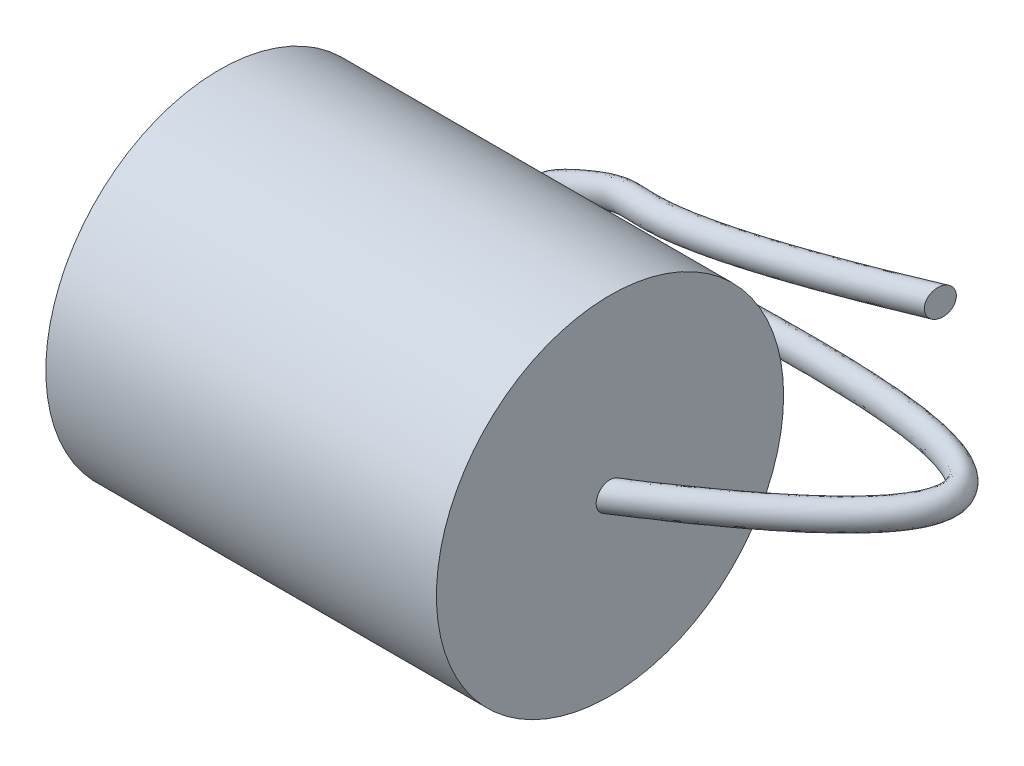
ISO-10303-21;
HEADER;
FILE_DESCRIPTION(('STEP AP214'),'2;1');
FILE_NAME('part.step','',(''),(''),'','','');
FILE_SCHEMA(('AUTOMOTIVE_DESIGN { 1 0 10303 214 1 1 1 1 }'));
ENDSEC;
DATA;
#1=APPLICATION_CONTEXT('core data for automotive mechanical design processes');
#2=APPLICATION_PROTOCOL_DEFINITION('international standard','automotive_design',2000,#1);
#3=PRODUCT_CONTEXT('',#1,'mechanical');
#4=PRODUCT('Part','Part','',(#3));
#5=PRODUCT_RELATED_PRODUCT_CATEGORY('part','',(#4));
#6=PRODUCT_DEFINITION_FORMATION('','',#4);
#7=PRODUCT_DEFINITION_CONTEXT('part definition',#1,'design');
#8=PRODUCT_DEFINITION('design','',#6,#7);
#9=PRODUCT_DEFINITION_SHAPE('','',#8);
#10=(LENGTH_UNIT() NAMED_UNIT(*) SI_UNIT(.MILLI.,.METRE.));
#11=(NAMED_UNIT(*) PLANE_ANGLE_UNIT() SI_UNIT($,.RADIAN.));
#12=(NAMED_UNIT(*) SI_UNIT($,.STERADIAN.) SOLID_ANGLE_UNIT());
#13=UNCERTAINTY_MEASURE_WITH_UNIT(LENGTH_MEASURE(1.E-05),#10,'distance_accuracy_value','');
#14=(GEOMETRIC_REPRESENTATION_CONTEXT(3) GLOBAL_UNCERTAINTY_ASSIGNED_CONTEXT((#13)) GLOBAL_UNIT_ASSIGNED_CONTEXT((#10,
#11,#12)) REPRESENTATION_CONTEXT('',''));
#15=CARTESIAN_POINT('',(0.,0.,0.));
#16=DIRECTION('',(0.,0.,1.));
#17=DIRECTION('',(1.,0.,0.));
#18=AXIS2_PLACEMENT_3D('',#15,#16,#17);
#19=CARTESIAN_POINT('',(450.,0.,0.));
#20=DIRECTION('',(1.,0.,0.));
#21=DIRECTION('',(0.,0.,-1.));
#22=AXIS2_PLACEMENT_3D('',#19,#20,#21);
#23=PLANE('',#22);
#24=CARTESIAN_POINT('',(450.,0.,0.));
#25=DIRECTION('',(1.,0.,0.));
#26=DIRECTION('',(0.,0.,-1.));
#27=AXIS2_PLACEMENT_3D('',#24,#25,#26);
#28=CIRCLE('',#27,15.9350485905769);
#29=CARTESIAN_POINT('',(450.,0.,-15.9350485905769));
#30=VERTEX_POINT('',#29);
#31=EDGE_CURVE('E50',#30,#30,#28,.T.);
#32=ORIENTED_EDGE('',*,*,#31,.F.);
#33=EDGE_LOOP('',(#32));
#34=FACE_BOUND('',#33,.T.);
#35=ADVANCED_FACE('F43',(#34),#23,.F.);
#36=CARTESIAN_POINT('',(447.290069253957,0.,-383.286785904496));
#37=DIRECTION('',(0.98502787894093,0.,0.172395120897123));
#38=DIRECTION('',(0.172395120897123,0.,-0.985027878940929));
#39=AXIS2_PLACEMENT_3D('',#36,#37,#38);
#40=PLANE('',#39);
#41=CARTESIAN_POINT('',(447.290069253957,0.,-383.286785904496));
#42=DIRECTION('',(0.98502787894093,0.,0.172395120897123));
#43=DIRECTION('',(0.172395120897123,0.,-0.985027878940929));
#44=AXIS2_PLACEMENT_3D('',#41,#42,#43);
#45=CIRCLE('',#44,15.9350485905769);
#46=CARTESIAN_POINT('',(450.037193882232,0.,-398.983253018492));
#47=VERTEX_POINT('',#46);
#48=EDGE_CURVE('E12',#47,#47,#45,.T.);
#49=ORIENTED_EDGE('',*,*,#48,.T.);
#50=EDGE_LOOP('',(#49));
#51=FACE_BOUND('',#50,.T.);
#52=ADVANCED_FACE('F57',(#51),#40,.T.);
#53=CARTESIAN_POINT('',(450.,0.,-15.9350485905769));
#54=CARTESIAN_POINT('',(487.283479928861,0.,-40.1159519894092));
#55=CARTESIAN_POINT('',(518.405820007918,0.,-62.0370961338193));
#56=CARTESIAN_POINT('',(569.416705538855,0.,-101.711499646057));
#57=CARTESIAN_POINT('',(589.311439955493,0.,-119.475308233721));
#58=CARTESIAN_POINT('',(611.39598139131,0.,-143.122673492521));
#59=CARTESIAN_POINT('',(617.461790071146,0.,-150.503703261148));
#60=CARTESIAN_POINT('',(627.081378567519,0.,-164.208016330983));
#61=CARTESIAN_POINT('',(630.631559728341,0.,-170.533813201194));
#62=CARTESIAN_POINT('',(635.320636420215,0.,-181.952414586559));
#63=CARTESIAN_POINT('',(636.446652271699,0.,-187.039181245159));
#64=CARTESIAN_POINT('',(636.637928823664,0.,-195.674883478979));
#65=CARTESIAN_POINT('',(635.710068352326,0.,-199.188418823437));
#66=CARTESIAN_POINT('',(632.687342817224,0.,-204.827936442351));
#67=CARTESIAN_POINT('',(630.644312282098,0.,-206.989363247134));
#68=CARTESIAN_POINT('',(625.780783864075,0.,-211.03226240499));
#69=CARTESIAN_POINT('',(622.916416421137,0.,-212.945461388225));
#70=CARTESIAN_POINT('',(615.916351511869,0.,-216.884123605242));
#71=CARTESIAN_POINT('',(611.770405099374,0.,-218.881893832985));
#72=CARTESIAN_POINT('',(602.065481974739,0.,-222.766773985541));
#73=CARTESIAN_POINT('',(596.514115226064,0.,-224.647174120432));
#74=CARTESIAN_POINT('',(577.919034649782,0.,-229.888470590968));
#75=CARTESIAN_POINT('',(562.94206395766,0.,-232.826200248209));
#76=CARTESIAN_POINT('',(529.194872719515,0.,-237.344073505341));
#77=CARTESIAN_POINT('',(510.430738213572,0.,-238.944055188897));
#78=CARTESIAN_POINT('',(450.486536042876,0.,-242.092466981928));
#79=CARTESIAN_POINT('',(405.667295489393,0.,-241.986459045099));
#80=CARTESIAN_POINT('',(316.497100986066,0.,-240.300330478789));
#81=CARTESIAN_POINT('',(272.145073032516,0.,-238.729418672953));
#82=CARTESIAN_POINT('',(213.28803847988,0.,-237.798982777849));
#83=CARTESIAN_POINT('',(194.946356355671,0.,-237.726689811192));
#84=CARTESIAN_POINT('',(161.945643882749,0.,-238.560494257816));
#85=CARTESIAN_POINT('',(147.300457735724,0.,-239.443610170207));
#86=CARTESIAN_POINT('',(128.743163388277,0.,-242.128635480911));
#87=CARTESIAN_POINT('',(123.122586879475,0.,-243.249610286713));
#88=CARTESIAN_POINT('',(115.55086220012,0.,-245.513552705508));
#89=CARTESIAN_POINT('',(113.169143591937,0.,-246.36694636955));
#90=CARTESIAN_POINT('',(108.687246242811,0.,-248.366307648322));
#91=CARTESIAN_POINT('',(106.58516168639,0.,-249.510364207201));
#92=CARTESIAN_POINT('',(102.682662562865,0.,-252.270436870069));
#93=CARTESIAN_POINT('',(100.874458771896,0.,-253.887082120539));
#94=CARTESIAN_POINT('',(97.7284373385258,0.,-257.901451778305));
#95=CARTESIAN_POINT('',(96.3821576593703,0.,-260.326637157124));
#96=CARTESIAN_POINT('',(95.1873582950007,0.,-264.657496508215));
#97=CARTESIAN_POINT('',(94.9328288478735,0.,-266.211428082342));
#98=CARTESIAN_POINT('',(94.7992228724063,0.,-269.434857001848));
#99=CARTESIAN_POINT('',(94.9226846071824,0.,-271.101779435734));
#100=CARTESIAN_POINT('',(95.5481657509826,0.,-274.370430953765));
#101=CARTESIAN_POINT('',(96.0485968048313,0.,-275.96802025896));
#102=CARTESIAN_POINT('',(97.3138355884439,0.,-278.955953766217));
#103=CARTESIAN_POINT('',(98.0750655570512,0.,-280.346100446228));
#104=CARTESIAN_POINT('',(100.464253247315,0.,-284.043305617499));
#105=CARTESIAN_POINT('',(102.098197081397,0.,-285.953505685394));
#106=CARTESIAN_POINT('',(105.290658715794,0.,-289.407336549074));
#107=CARTESIAN_POINT('',(106.873165852383,0.,-290.946487403058));
#108=CARTESIAN_POINT('',(111.683013595245,0.,-295.383906776255));
#109=CARTESIAN_POINT('',(115.001717199517,0.,-298.111211161091));
#110=CARTESIAN_POINT('',(121.960437207708,0.,-303.373313108974));
#111=CARTESIAN_POINT('',(125.583550719089,0.,-305.880360072179));
#112=CARTESIAN_POINT('',(132.828644665928,0.,-310.451659336116));
#113=CARTESIAN_POINT('',(136.439413194835,0.,-312.513954777053));
#114=CARTESIAN_POINT('',(143.283964795914,0.,-315.85940289586));
#115=CARTESIAN_POINT('',(146.544405257232,0.,-317.151843616704));
#116=CARTESIAN_POINT('',(152.93439953659,0.,-319.066434200642));
#117=CARTESIAN_POINT('',(156.064000222027,0.,-319.683608204799));
#118=CARTESIAN_POINT('',(162.151177224142,0.,-320.37230655808));
#119=CARTESIAN_POINT('',(165.099127564158,0.,-320.44566132333));
#120=CARTESIAN_POINT('',(170.750506386605,0.,-320.337411761649));
#121=CARTESIAN_POINT('',(173.4522066844,0.,-320.163684004382));
#122=CARTESIAN_POINT('',(181.392950865369,0.,-319.670537077123));
#123=CARTESIAN_POINT('',(186.478715517806,0.,-319.411509515092));
#124=CARTESIAN_POINT('',(198.35036680869,0.,-319.66500560622));
#125=CARTESIAN_POINT('',(205.154785076576,0.,-320.128114685212));
#126=CARTESIAN_POINT('',(222.374376223485,0.,-322.358936763319));
#127=CARTESIAN_POINT('',(232.783783798729,0.,-324.137724010347));
#128=CARTESIAN_POINT('',(258.72849824763,0.,-330.003874443711));
#129=CARTESIAN_POINT('',(274.257797072658,0.,-334.096811234494));
#130=CARTESIAN_POINT('',(330.586988386846,0.,-351.436493906954));
#131=CARTESIAN_POINT('',(381.119046144559,0.,-369.75328644697));
#132=CARTESIAN_POINT('',(450.037193882232,0.,-398.983253018492));
#133=CARTESIAN_POINT('',(450.,31.8700971811538,-15.9350485905769));
#134=CARTESIAN_POINT('',(487.283479928861,31.8700971811538,-40.1159519894092));
#135=CARTESIAN_POINT('',(518.405820007918,31.8700971811538,-62.0370961338193));
#136=CARTESIAN_POINT('',(569.416705538855,31.8700971811538,-101.711499646057));
#137=CARTESIAN_POINT('',(589.311439955493,31.8700971811538,-119.475308233721));
#138=CARTESIAN_POINT('',(611.39598139131,31.8700971811538,-143.122673492521));
#139=CARTESIAN_POINT('',(617.461790071146,31.8700971811538,-150.503703261148));
#140=CARTESIAN_POINT('',(627.081378567519,31.8700971811538,-164.208016330983));
#141=CARTESIAN_POINT('',(630.631559728341,31.8700971811538,-170.533813201194));
#142=CARTESIAN_POINT('',(635.320636420215,31.8700971811538,-181.952414586559));
#143=CARTESIAN_POINT('',(636.446652271699,31.8700971811538,-187.039181245159));
#144=CARTESIAN_POINT('',(636.637928823664,31.8700971811538,-195.674883478979));
#145=CARTESIAN_POINT('',(635.710068352326,31.8700971811538,-199.188418823438));
#146=CARTESIAN_POINT('',(632.687342817224,31.8700971811538,-204.827936442351));
#147=CARTESIAN_POINT('',(630.644312282098,31.8700971811538,-206.989363247134));
#148=CARTESIAN_POINT('',(625.780783864075,31.8700971811538,-211.03226240499));
#149=CARTESIAN_POINT('',(622.916416421137,31.8700971811538,-212.945461388225));
#150=CARTESIAN_POINT('',(615.916351511869,31.8700971811538,-216.884123605242));
#151=CARTESIAN_POINT('',(611.770405099374,31.8700971811538,-218.881893832985));
#152=CARTESIAN_POINT('',(602.065481974739,31.8700971811538,-222.766773985541));
#153=CARTESIAN_POINT('',(596.514115226064,31.8700971811538,-224.647174120432));
#154=CARTESIAN_POINT('',(577.919034649782,31.8700971811538,-229.888470590968));
#155=CARTESIAN_POINT('',(562.94206395766,31.8700971811538,-232.826200248209));
#156=CARTESIAN_POINT('',(529.194872719515,31.8700971811538,-237.344073505341));
#157=CARTESIAN_POINT('',(510.430738213572,31.8700971811538,-238.944055188897));
#158=CARTESIAN_POINT('',(450.486536042876,31.8700971811538,-242.092466981928));
#159=CARTESIAN_POINT('',(405.667295489393,31.8700971811538,-241.986459045099));
#160=CARTESIAN_POINT('',(316.497100986066,31.8700971811538,-240.300330478789));
#161=CARTESIAN_POINT('',(272.145073032516,31.8700971811538,-238.729418672953));
#162=CARTESIAN_POINT('',(213.28803847988,31.8700971811538,-237.798982777849));
#163=CARTESIAN_POINT('',(194.946356355671,31.8700971811538,-237.726689811192));
#164=CARTESIAN_POINT('',(161.945643882749,31.8700971811538,-238.560494257816));
#165=CARTESIAN_POINT('',(147.300457735724,31.8700971811538,-239.443610170207));
#166=CARTESIAN_POINT('',(128.743163388277,31.8700971811538,-242.128635480911));
#167=CARTESIAN_POINT('',(123.122586879475,31.8700971811538,-243.249610286713));
#168=CARTESIAN_POINT('',(115.55086220012,31.8700971811538,-245.513552705508));
#169=CARTESIAN_POINT('',(113.169143591937,31.8700971811538,-246.36694636955));
#170=CARTESIAN_POINT('',(108.687246242811,31.8700971811538,-248.366307648322));
#171=CARTESIAN_POINT('',(106.58516168639,31.8700971811538,-249.510364207201));
#172=CARTESIAN_POINT('',(102.682662562865,31.8700971811538,-252.27043687007));
#173=CARTESIAN_POINT('',(100.874458771896,31.8700971811538,-253.887082120539));
#174=CARTESIAN_POINT('',(97.7284373385258,31.8700971811538,-257.901451778305));
#175=CARTESIAN_POINT('',(96.3821576593703,31.8700971811538,-260.326637157124));
#176=CARTESIAN_POINT('',(95.1873582950007,31.8700971811538,-264.657496508215));
#177=CARTESIAN_POINT('',(94.9328288478735,31.8700971811538,-266.211428082342));
#178=CARTESIAN_POINT('',(94.7992228724063,31.8700971811538,-269.434857001848));
#179=CARTESIAN_POINT('',(94.9226846071825,31.8700971811538,-271.101779435734));
#180=CARTESIAN_POINT('',(95.5481657509826,31.8700971811538,-274.370430953765));
#181=CARTESIAN_POINT('',(96.0485968048313,31.8700971811538,-275.96802025896));
#182=CARTESIAN_POINT('',(97.3138355884439,31.8700971811538,-278.955953766217));
#183=CARTESIAN_POINT('',(98.0750655570512,31.8700971811538,-280.346100446228));
#184=CARTESIAN_POINT('',(100.464253247315,31.8700971811538,-284.043305617499));
#185=CARTESIAN_POINT('',(102.098197081397,31.8700971811538,-285.953505685394));
#186=CARTESIAN_POINT('',(105.290658715794,31.8700971811538,-289.407336549074));
#187=CARTESIAN_POINT('',(106.873165852384,31.8700971811538,-290.946487403058));
#188=CARTESIAN_POINT('',(111.683013595245,31.8700971811538,-295.383906776255));
#189=CARTESIAN_POINT('',(115.001717199517,31.8700971811538,-298.111211161091));
#190=CARTESIAN_POINT('',(121.960437207708,31.8700971811538,-303.373313108974));
#191=CARTESIAN_POINT('',(125.583550719089,31.8700971811538,-305.880360072179));
#192=CARTESIAN_POINT('',(132.828644665928,31.8700971811538,-310.451659336116));
#193=CARTESIAN_POINT('',(136.439413194835,31.8700971811538,-312.513954777053));
#194=CARTESIAN_POINT('',(143.283964795914,31.8700971811538,-315.85940289586));
#195=CARTESIAN_POINT('',(146.544405257232,31.8700971811538,-317.151843616704));
#196=CARTESIAN_POINT('',(152.93439953659,31.8700971811538,-319.066434200642));
#197=CARTESIAN_POINT('',(156.064000222027,31.8700971811538,-319.683608204799));
#198=CARTESIAN_POINT('',(162.151177224142,31.8700971811538,-320.37230655808));
#199=CARTESIAN_POINT('',(165.099127564158,31.8700971811538,-320.44566132333));
#200=CARTESIAN_POINT('',(170.750506386605,31.8700971811538,-320.337411761649));
#201=CARTESIAN_POINT('',(173.4522066844,31.8700971811538,-320.163684004382));
#202=CARTESIAN_POINT('',(181.392950865369,31.8700971811538,-319.670537077123));
#203=CARTESIAN_POINT('',(186.478715517806,31.8700971811538,-319.411509515092));
#204=CARTESIAN_POINT('',(198.35036680869,31.8700971811538,-319.66500560622));
#205=CARTESIAN_POINT('',(205.154785076576,31.8700971811538,-320.128114685212));
#206=CARTESIAN_POINT('',(222.374376223485,31.8700971811538,-322.358936763319));
#207=CARTESIAN_POINT('',(232.783783798729,31.8700971811538,-324.137724010347));
#208=CARTESIAN_POINT('',(258.72849824763,31.8700971811538,-330.003874443711));
#209=CARTESIAN_POINT('',(274.257797072658,31.8700971811538,-334.096811234494));
#210=CARTESIAN_POINT('',(330.586988386846,31.8700971811538,-351.436493906954));
#211=CARTESIAN_POINT('',(381.119046144559,31.8700971811538,-369.75328644697));
#212=CARTESIAN_POINT('',(450.037193882232,31.8700971811538,-398.983253018492));
#213=CARTESIAN_POINT('',(450.,31.8700971811538,15.9350485905769));
#214=CARTESIAN_POINT('',(487.948222753525,31.8700971811538,-8.24585480856572));
#215=CARTESIAN_POINT('',(519.875767458581,31.8700971811538,-30.1820120849856));
#216=CARTESIAN_POINT('',(573.074107983889,31.8700971811538,-70.0329496071743));
#217=CARTESIAN_POINT('',(594.338714872811,31.8700971811538,-87.9371806318083));
#218=CARTESIAN_POINT('',(619.430097091602,31.8700971811538,-112.264740118511));
#219=CARTESIAN_POINT('',(626.662414916646,31.8700971811538,-119.954162826123));
#220=CARTESIAN_POINT('',(639.093853217101,31.8700971811538,-134.6508451012));
#221=CARTESIAN_POINT('',(644.296572345665,31.8700971811538,-141.655591100862));
#222=CARTESIAN_POINT('',(652.87720657848,31.8700971811538,-155.260634470481));
#223=CARTESIAN_POINT('',(656.26800135455,31.8700971811538,-161.866969695235));
#224=CARTESIAN_POINT('',(661.18339295356,31.8700971811538,-175.082498857955));
#225=CARTESIAN_POINT('',(662.701110943773,31.8700971811538,-181.727093026576));
#226=CARTESIAN_POINT('',(663.285734957927,31.8700971811538,-194.971330681788));
#227=CARTESIAN_POINT('',(662.30080645289,31.8700971811538,-201.535529636209));
#228=CARTESIAN_POINT('',(657.799736783493,31.8700971811538,-213.613846861236));
#229=CARTESIAN_POINT('',(654.327465176799,31.8700971811538,-219.096238501295));
#230=CARTESIAN_POINT('',(645.654708534103,31.8700971811538,-228.721191008817));
#231=CARTESIAN_POINT('',(640.46447243825,31.8700971811538,-232.891444885101));
#232=CARTESIAN_POINT('',(628.806623649466,31.8700971811538,-240.217515032561));
#233=CARTESIAN_POINT('',(622.331400983792,31.8700971811538,-243.38004109818));
#234=CARTESIAN_POINT('',(601.274807794766,31.8700971811538,-251.733579292899));
#235=CARTESIAN_POINT('',(585.054788601338,31.8700971811538,-255.813814172833));
#236=CARTESIAN_POINT('',(549.356011041701,31.8700971811538,-262.06110177923));
#237=CARTESIAN_POINT('',(529.871166649746,31.8700971811538,-264.208316416651));
#238=CARTESIAN_POINT('',(468.200087222783,31.8700971811538,-268.624964674355));
#239=CARTESIAN_POINT('',(422.784680161595,31.8700971811538,-268.872307418009));
#240=CARTESIAN_POINT('',(332.954732307611,31.8700971811538,-267.595019924955));
#241=CARTESIAN_POINT('',(288.541265508462,31.8700971811538,-266.061180879245));
#242=CARTESIAN_POINT('',(230.19047703182,31.8700971811538,-264.818419856042));
#243=CARTESIAN_POINT('',(212.119621326518,31.8700971811538,-264.580302072708));
#244=CARTESIAN_POINT('',(180.0818235882,31.8700971811538,-264.773401516579));
#245=CARTESIAN_POINT('',(166.101037345564,31.8700971811538,-265.22760024029));
#246=CARTESIAN_POINT('',(149.414116501308,31.8700971811538,-266.399152627179));
#247=CARTESIAN_POINT('',(144.569078509497,31.8700971811538,-266.872138009023));
#248=CARTESIAN_POINT('',(138.597919699056,31.8700971811538,-267.538638770733));
#249=CARTESIAN_POINT('',(136.824600186987,31.8700971811538,-267.751976649658));
#250=CARTESIAN_POINT('',(133.753576118954,31.8700971811538,-268.078721332532));
#251=CARTESIAN_POINT('',(132.457777377173,31.8700971811538,-268.194039192903));
#252=CARTESIAN_POINT('',(130.360306796833,31.8700971811538,-268.158166821632));
#253=CARTESIAN_POINT('',(129.566424180645,31.8700971811538,-268.006347443261));
#254=CARTESIAN_POINT('',(128.342711761511,31.8700971811538,-267.139889561102));
#255=CARTESIAN_POINT('',(127.921343993166,31.8700971811538,-266.397790084688));
#256=CARTESIAN_POINT('',(127.119482960201,31.8700971811538,-264.764861043457));
#257=CARTESIAN_POINT('',(126.817594069264,31.8700971811538,-264.139123148391));
#258=CARTESIAN_POINT('',(126.06146388629,31.8700971811538,-262.83144981131));
#259=CARTESIAN_POINT('',(125.604684329258,31.8700971811538,-262.152089280495));
#260=CARTESIAN_POINT('',(124.540498317294,31.8700971811538,-260.919530864997));
#261=CARTESIAN_POINT('',(123.934680215645,31.8700971811538,-260.370472758957));
#262=CARTESIAN_POINT('',(122.691428371354,31.8700971811538,-259.542172018747));
#263=CARTESIAN_POINT('',(122.057572388726,31.8700971811538,-259.26312690647));
#264=CARTESIAN_POINT('',(120.38188757354,31.8700971811538,-258.879358132878));
#265=CARTESIAN_POINT('',(119.643416117769,31.8700971811538,-259.255044011017));
#266=CARTESIAN_POINT('',(118.960389254846,31.8700971811538,-260.532069714843));
#267=CARTESIAN_POINT('',(118.991844518616,31.8700971811538,-261.437889486222));
#268=CARTESIAN_POINT('',(119.894936637345,31.8700971811538,-264.465725520604));
#269=CARTESIAN_POINT('',(121.546263174031,31.8700971811538,-266.889049458067));
#270=CARTESIAN_POINT('',(125.74810462628,31.8700971811538,-271.698275003545));
#271=CARTESIAN_POINT('',(128.315522445167,31.8700971811538,-274.111927216628));
#272=CARTESIAN_POINT('',(133.569686407712,31.8700971811538,-278.574585242656));
#273=CARTESIAN_POINT('',(136.267644466065,31.8700971811538,-280.625547921381));
#274=CARTESIAN_POINT('',(140.94651755747,31.8700971811538,-284.05702046465));
#275=CARTESIAN_POINT('',(142.919196259871,31.8700971811538,-285.454166501472));
#276=CARTESIAN_POINT('',(146.392841364302,31.8700971811538,-287.839956791057));
#277=CARTESIAN_POINT('',(147.893760894594,31.8700971811538,-288.833576899081));
#278=CARTESIAN_POINT('',(150.809694998262,31.8700971811538,-290.541986024255));
#279=CARTESIAN_POINT('',(152.234335542475,31.8700971811538,-291.254944619433));
#280=CARTESIAN_POINT('',(155.414878778867,31.8700971811538,-292.365652049024));
#281=CARTESIAN_POINT('',(157.172509648874,31.8700971811538,-292.755524308036));
#282=CARTESIAN_POINT('',(163.256873830806,31.8700971811538,-293.42331930047));
#283=CARTESIAN_POINT('',(168.38400121255,31.8700971811538,-293.167064969385));
#284=CARTESIAN_POINT('',(181.421130517063,31.8700971811538,-292.654072377173));
#285=CARTESIAN_POINT('',(189.312600803753,31.8700971811538,-292.446748684585));
#286=CARTESIAN_POINT('',(208.725140208063,31.8700971811538,-293.533059805837));
#287=CARTESIAN_POINT('',(220.251974627948,31.8700971811538,-294.815620366396));
#288=CARTESIAN_POINT('',(248.177454531455,31.8700971811538,-299.912223115065));
#289=CARTESIAN_POINT('',(264.582108063487,31.8700971811538,-303.720691699564));
#290=CARTESIAN_POINT('',(323.187374742461,31.8700971811538,-320.397054192261));
#291=CARTESIAN_POINT('',(374.78842356563,31.8700971811538,-338.506730491628));
#292=CARTESIAN_POINT('',(444.542944625684,31.8700971811538,-367.590318790499));
#293=CARTESIAN_POINT('',(450.,0.,15.9350485905769));
#294=CARTESIAN_POINT('',(487.948222753525,0.,-8.24585480856572));
#295=CARTESIAN_POINT('',(519.875767458581,0.,-30.1820120849856));
#296=CARTESIAN_POINT('',(573.074107983889,0.,-70.0329496071743));
#297=CARTESIAN_POINT('',(594.338714872811,0.,-87.9371806317305));
#298=CARTESIAN_POINT('',(619.430097091602,0.,-112.26474011855));
#299=CARTESIAN_POINT('',(626.662414916646,0.,-119.95416282606));
#300=CARTESIAN_POINT('',(639.093853217101,0.,-134.650845101262));
#301=CARTESIAN_POINT('',(644.296572345664,0.,-141.655591100911));
#302=CARTESIAN_POINT('',(652.877206578479,0.,-155.260634470431));
#303=CARTESIAN_POINT('',(656.26800135455,0.,-161.866969695235));
#304=CARTESIAN_POINT('',(661.18339295356,0.,-175.082498857955));
#305=CARTESIAN_POINT('',(662.701110943773,0.,-181.727093026576));
#306=CARTESIAN_POINT('',(663.285734957927,0.,-194.971330681788));
#307=CARTESIAN_POINT('',(662.30080645289,0.,-201.535529636209));
#308=CARTESIAN_POINT('',(657.799736783493,0.,-213.613846861236));
#309=CARTESIAN_POINT('',(654.327465176799,0.,-219.096238501295));
#310=CARTESIAN_POINT('',(645.654708534103,0.,-228.721191008817));
#311=CARTESIAN_POINT('',(640.46447243825,0.,-232.891444885101));
#312=CARTESIAN_POINT('',(628.806623649466,0.,-240.217515032561));
#313=CARTESIAN_POINT('',(622.331400983792,0.,-243.38004109818));
#314=CARTESIAN_POINT('',(601.274807794766,0.,-251.733579292899));
#315=CARTESIAN_POINT('',(585.054788601338,0.,-255.813814172833));
#316=CARTESIAN_POINT('',(549.356011041701,0.,-262.06110177923));
#317=CARTESIAN_POINT('',(529.871166649746,0.,-264.208316416651));
#318=CARTESIAN_POINT('',(468.200087222783,0.,-268.624964674355));
#319=CARTESIAN_POINT('',(422.784680161595,0.,-268.872307418009));
#320=CARTESIAN_POINT('',(332.954732307611,0.,-267.595019924955));
#321=CARTESIAN_POINT('',(288.541265508462,0.,-266.061180879245));
#322=CARTESIAN_POINT('',(230.19047703182,0.,-264.818419856042));
#323=CARTESIAN_POINT('',(212.119621326518,0.,-264.580302072708));
#324=CARTESIAN_POINT('',(180.0818235882,0.,-264.773401516579));
#325=CARTESIAN_POINT('',(166.101037345564,0.,-265.22760024029));
#326=CARTESIAN_POINT('',(149.414116501309,0.,-266.399152627179));
#327=CARTESIAN_POINT('',(144.569078509433,0.,-266.872138009022));
#328=CARTESIAN_POINT('',(138.597919699088,0.,-267.538638770733));
#329=CARTESIAN_POINT('',(136.824600187015,0.,-267.751976649658));
#330=CARTESIAN_POINT('',(133.753576118926,0.,-268.078721332532));
#331=CARTESIAN_POINT('',(132.457777377173,0.,-268.194039192903));
#332=CARTESIAN_POINT('',(130.360306796834,0.,-268.158166821632));
#333=CARTESIAN_POINT('',(129.566424180636,0.,-268.006347443261));
#334=CARTESIAN_POINT('',(128.342711761521,0.,-267.139889561102));
#335=CARTESIAN_POINT('',(127.921343993174,0.,-266.397790084688));
#336=CARTESIAN_POINT('',(127.119482960197,0.,-264.764861043457));
#337=CARTESIAN_POINT('',(126.817594069264,0.,-264.139123148391));
#338=CARTESIAN_POINT('',(126.06146388629,0.,-262.83144981131));
#339=CARTESIAN_POINT('',(125.604684329255,0.,-262.152089280495));
#340=CARTESIAN_POINT('',(124.540498317297,0.,-260.919530864997));
#341=CARTESIAN_POINT('',(123.934680215637,0.,-260.370472758957));
#342=CARTESIAN_POINT('',(122.691428371361,0.,-259.542172018747));
#343=CARTESIAN_POINT('',(122.057572388726,0.,-259.26312690647));
#344=CARTESIAN_POINT('',(120.38188757354,0.,-258.879358132878));
#345=CARTESIAN_POINT('',(119.643416117769,0.,-259.255044011017));
#346=CARTESIAN_POINT('',(118.960389254846,0.,-260.532069714843));
#347=CARTESIAN_POINT('',(118.991844518616,0.,-261.437889486222));
#348=CARTESIAN_POINT('',(119.894936637344,0.,-264.465725520604));
#349=CARTESIAN_POINT('',(121.546263174031,0.,-266.889049458119));
#350=CARTESIAN_POINT('',(125.74810462628,0.,-271.698275003493));
#351=CARTESIAN_POINT('',(128.315522445167,0.,-274.111927216628));
#352=CARTESIAN_POINT('',(133.569686407712,0.,-278.574585242656));
#353=CARTESIAN_POINT('',(136.267644466065,0.,-280.625547921381));
#354=CARTESIAN_POINT('',(140.94651755747,0.,-284.05702046465));
#355=CARTESIAN_POINT('',(142.919196259871,0.,-285.454166501472));
#356=CARTESIAN_POINT('',(146.392841364302,0.,-287.839956791057));
#357=CARTESIAN_POINT('',(147.893760894594,0.,-288.833576899114));
#358=CARTESIAN_POINT('',(150.809694998262,0.,-290.541986024222));
#359=CARTESIAN_POINT('',(152.234335542475,0.,-291.254944619433));
#360=CARTESIAN_POINT('',(155.414878778867,0.,-292.365652049024));
#361=CARTESIAN_POINT('',(157.172509648874,0.,-292.755524308036));
#362=CARTESIAN_POINT('',(163.256873830806,0.,-293.42331930047));
#363=CARTESIAN_POINT('',(168.384001212549,0.,-293.167064969385));
#364=CARTESIAN_POINT('',(181.421130517063,0.,-292.654072377173));
#365=CARTESIAN_POINT('',(189.312600803753,0.,-292.446748684585));
#366=CARTESIAN_POINT('',(208.725140208063,0.,-293.533059805837));
#367=CARTESIAN_POINT('',(220.251974627948,0.,-294.815620366396));
#368=CARTESIAN_POINT('',(248.177454531455,0.,-299.912223115065));
#369=CARTESIAN_POINT('',(264.582108063487,0.,-303.720691699564));
#370=CARTESIAN_POINT('',(323.187374742461,0.,-320.397054192261));
#371=CARTESIAN_POINT('',(374.78842356563,0.,-338.506730491628));
#372=CARTESIAN_POINT('',(444.542944625683,0.,-367.590318790499));
#373=CARTESIAN_POINT('',(450.,-31.8700971811538,15.9350485905769));
#374=CARTESIAN_POINT('',(487.948222753525,-31.8700971811538,-8.24585480856571));
#375=CARTESIAN_POINT('',(519.875767458581,-31.8700971811538,-30.1820120849856));
#376=CARTESIAN_POINT('',(573.074107983889,-31.8700971811538,-70.0329496071743));
#377=CARTESIAN_POINT('',(594.338714872811,-31.8700971811538,-87.9371806316527));
#378=CARTESIAN_POINT('',(619.430097091602,-31.8700971811538,-112.264740118589));
#379=CARTESIAN_POINT('',(626.662414916646,-31.8700971811538,-119.954162825998));
#380=CARTESIAN_POINT('',(639.093853217101,-31.8700971811538,-134.650845101324));
#381=CARTESIAN_POINT('',(644.296572345665,-31.8700971811538,-141.655591100961));
#382=CARTESIAN_POINT('',(652.87720657848,-31.8700971811538,-155.260634470382));
#383=CARTESIAN_POINT('',(656.26800135455,-31.8700971811538,-161.866969695235));
#384=CARTESIAN_POINT('',(661.18339295356,-31.8700971811538,-175.082498857955));
#385=CARTESIAN_POINT('',(662.701110943773,-31.8700971811538,-181.727093026576));
#386=CARTESIAN_POINT('',(663.285734957927,-31.8700971811538,-194.971330681788));
#387=CARTESIAN_POINT('',(662.30080645289,-31.8700971811538,-201.535529636209));
#388=CARTESIAN_POINT('',(657.799736783493,-31.8700971811538,-213.613846861236));
#389=CARTESIAN_POINT('',(654.327465176799,-31.8700971811538,-219.096238501295));
#390=CARTESIAN_POINT('',(645.654708534103,-31.8700971811538,-228.721191008817));
#391=CARTESIAN_POINT('',(640.46447243825,-31.8700971811538,-232.891444885101));
#392=CARTESIAN_POINT('',(628.806623649466,-31.8700971811538,-240.217515032561));
#393=CARTESIAN_POINT('',(622.331400983792,-31.8700971811538,-243.38004109818));
#394=CARTESIAN_POINT('',(601.274807794766,-31.8700971811538,-251.733579292899));
#395=CARTESIAN_POINT('',(585.054788601338,-31.8700971811538,-255.813814172833));
#396=CARTESIAN_POINT('',(549.356011041701,-31.8700971811538,-262.06110177923));
#397=CARTESIAN_POINT('',(529.871166649746,-31.8700971811538,-264.208316416651));
#398=CARTESIAN_POINT('',(468.200087222783,-31.8700971811538,-268.624964674355));
#399=CARTESIAN_POINT('',(422.784680161595,-31.8700971811538,-268.872307418009));
#400=CARTESIAN_POINT('',(332.954732307611,-31.8700971811538,-267.595019924955));
#401=CARTESIAN_POINT('',(288.541265508462,-31.8700971811538,-266.061180879245));
#402=CARTESIAN_POINT('',(230.19047703182,-31.8700971811538,-264.818419856042));
#403=CARTESIAN_POINT('',(212.119621326518,-31.8700971811538,-264.580302072708));
#404=CARTESIAN_POINT('',(180.0818235882,-31.8700971811538,-264.773401516579));
#405=CARTESIAN_POINT('',(166.101037345564,-31.8700971811538,-265.22760024029));
#406=CARTESIAN_POINT('',(149.414116501308,-31.8700971811538,-266.399152627179));
#407=CARTESIAN_POINT('',(144.569078509369,-31.8700971811538,-266.872138009023));
#408=CARTESIAN_POINT('',(138.59791969912,-31.8700971811538,-267.538638770733));
#409=CARTESIAN_POINT('',(136.824600187042,-31.8700971811538,-267.751976649658));
#410=CARTESIAN_POINT('',(133.753576118899,-31.8700971811538,-268.078721332532));
#411=CARTESIAN_POINT('',(132.457777377173,-31.8700971811538,-268.194039192903));
#412=CARTESIAN_POINT('',(130.360306796833,-31.8700971811538,-268.158166821632));
#413=CARTESIAN_POINT('',(129.566424180626,-31.8700971811538,-268.006347443261));
#414=CARTESIAN_POINT('',(128.34271176153,-31.8700971811538,-267.139889561102));
#415=CARTESIAN_POINT('',(127.921343993182,-31.8700971811538,-266.397790084688));
#416=CARTESIAN_POINT('',(127.119482960193,-31.8700971811538,-264.764861043457));
#417=CARTESIAN_POINT('',(126.817594069264,-31.8700971811538,-264.139123148391));
#418=CARTESIAN_POINT('',(126.06146388629,-31.8700971811538,-262.83144981131));
#419=CARTESIAN_POINT('',(125.604684329251,-31.8700971811538,-262.152089280495));
#420=CARTESIAN_POINT('',(124.540498317301,-31.8700971811538,-260.919530864997));
#421=CARTESIAN_POINT('',(123.93468021563,-31.8700971811538,-260.370472758957));
#422=CARTESIAN_POINT('',(122.691428371369,-31.8700971811538,-259.542172018747));
#423=CARTESIAN_POINT('',(122.057572388726,-31.8700971811538,-259.26312690647));
#424=CARTESIAN_POINT('',(120.38188757354,-31.8700971811538,-258.879358132878));
#425=CARTESIAN_POINT('',(119.643416117769,-31.8700971811538,-259.255044011017));
#426=CARTESIAN_POINT('',(118.960389254846,-31.8700971811538,-260.532069714843));
#427=CARTESIAN_POINT('',(118.991844518616,-31.8700971811538,-261.437889486222));
#428=CARTESIAN_POINT('',(119.894936637345,-31.8700971811538,-264.465725520604));
#429=CARTESIAN_POINT('',(121.546263174031,-31.8700971811538,-266.889049458171));
#430=CARTESIAN_POINT('',(125.74810462628,-31.8700971811538,-271.698275003441));
#431=CARTESIAN_POINT('',(128.315522445167,-31.8700971811538,-274.111927216628));
#432=CARTESIAN_POINT('',(133.569686407712,-31.8700971811538,-278.574585242656));
#433=CARTESIAN_POINT('',(136.267644466065,-31.8700971811538,-280.625547921381));
#434=CARTESIAN_POINT('',(140.94651755747,-31.8700971811538,-284.05702046465));
#435=CARTESIAN_POINT('',(142.919196259871,-31.8700971811538,-285.454166501472));
#436=CARTESIAN_POINT('',(146.392841364302,-31.8700971811538,-287.839956791057));
#437=CARTESIAN_POINT('',(147.893760894594,-31.8700971811538,-288.833576899146));
#438=CARTESIAN_POINT('',(150.809694998262,-31.8700971811538,-290.54198602419));
#439=CARTESIAN_POINT('',(152.234335542475,-31.8700971811538,-291.254944619433));
#440=CARTESIAN_POINT('',(155.414878778867,-31.8700971811538,-292.365652049024));
#441=CARTESIAN_POINT('',(157.172509648874,-31.8700971811538,-292.755524308036));
#442=CARTESIAN_POINT('',(163.256873830806,-31.8700971811538,-293.42331930047));
#443=CARTESIAN_POINT('',(168.38400121255,-31.8700971811538,-293.167064969385));
#444=CARTESIAN_POINT('',(181.421130517063,-31.8700971811538,-292.654072377173));
#445=CARTESIAN_POINT('',(189.312600803753,-31.8700971811538,-292.446748684585));
#446=CARTESIAN_POINT('',(208.725140208063,-31.8700971811538,-293.533059805837));
#447=CARTESIAN_POINT('',(220.251974627948,-31.8700971811538,-294.815620366396));
#448=CARTESIAN_POINT('',(248.177454531455,-31.8700971811538,-299.912223115065));
#449=CARTESIAN_POINT('',(264.582108063487,-31.8700971811538,-303.720691699564));
#450=CARTESIAN_POINT('',(323.187374742461,-31.8700971811538,-320.397054192261));
#451=CARTESIAN_POINT('',(374.78842356563,-31.8700971811538,-338.506730491628));
#452=CARTESIAN_POINT('',(444.542944625684,-31.8700971811538,-367.590318790499));
#453=CARTESIAN_POINT('',(450.,-31.8700971811538,-15.9350485905769));
#454=CARTESIAN_POINT('',(487.283479928861,-31.8700971811538,-40.1159519894092));
#455=CARTESIAN_POINT('',(518.405820007918,-31.8700971811538,-62.0370961338193));
#456=CARTESIAN_POINT('',(569.416705538855,-31.8700971811538,-101.711499646057));
#457=CARTESIAN_POINT('',(589.311439955493,-31.8700971811538,-119.475308233721));
#458=CARTESIAN_POINT('',(611.39598139131,-31.8700971811538,-143.122673492521));
#459=CARTESIAN_POINT('',(617.461790071146,-31.8700971811538,-150.503703261148));
#460=CARTESIAN_POINT('',(627.081378567519,-31.8700971811538,-164.208016330983));
#461=CARTESIAN_POINT('',(630.631559728341,-31.8700971811538,-170.533813201194));
#462=CARTESIAN_POINT('',(635.320636420215,-31.8700971811538,-181.952414586559));
#463=CARTESIAN_POINT('',(636.446652271699,-31.8700971811538,-187.039181245159));
#464=CARTESIAN_POINT('',(636.637928823664,-31.8700971811538,-195.674883478979));
#465=CARTESIAN_POINT('',(635.710068352326,-31.8700971811538,-199.188418823438));
#466=CARTESIAN_POINT('',(632.687342817224,-31.8700971811538,-204.827936442351));
#467=CARTESIAN_POINT('',(630.644312282098,-31.8700971811538,-206.989363247134));
#468=CARTESIAN_POINT('',(625.780783864075,-31.8700971811538,-211.03226240499));
#469=CARTESIAN_POINT('',(622.916416421137,-31.8700971811538,-212.945461388225));
#470=CARTESIAN_POINT('',(615.916351511869,-31.8700971811538,-216.884123605242));
#471=CARTESIAN_POINT('',(611.770405099374,-31.8700971811538,-218.881893832985));
#472=CARTESIAN_POINT('',(602.065481974739,-31.8700971811538,-222.766773985541));
#473=CARTESIAN_POINT('',(596.514115226064,-31.8700971811538,-224.647174120432));
#474=CARTESIAN_POINT('',(577.919034649782,-31.8700971811538,-229.888470590968));
#475=CARTESIAN_POINT('',(562.94206395766,-31.8700971811538,-232.826200248209));
#476=CARTESIAN_POINT('',(529.194872719515,-31.8700971811538,-237.344073505341));
#477=CARTESIAN_POINT('',(510.430738213572,-31.8700971811538,-238.944055188897));
#478=CARTESIAN_POINT('',(450.486536042876,-31.8700971811538,-242.092466981928));
#479=CARTESIAN_POINT('',(405.667295489393,-31.8700971811538,-241.986459045099));
#480=CARTESIAN_POINT('',(316.497100986066,-31.8700971811538,-240.300330478789));
#481=CARTESIAN_POINT('',(272.145073032516,-31.8700971811538,-238.729418672953));
#482=CARTESIAN_POINT('',(213.28803847988,-31.8700971811538,-237.798982777849));
#483=CARTESIAN_POINT('',(194.946356355671,-31.8700971811538,-237.726689811192));
#484=CARTESIAN_POINT('',(161.945643882749,-31.8700971811538,-238.560494257816));
#485=CARTESIAN_POINT('',(147.300457735724,-31.8700971811538,-239.443610170207));
#486=CARTESIAN_POINT('',(128.743163388277,-31.8700971811538,-242.128635480911));
#487=CARTESIAN_POINT('',(123.122586879475,-31.8700971811538,-243.249610286713));
#488=CARTESIAN_POINT('',(115.55086220012,-31.8700971811538,-245.513552705508));
#489=CARTESIAN_POINT('',(113.169143591937,-31.8700971811538,-246.36694636955));
#490=CARTESIAN_POINT('',(108.687246242811,-31.8700971811538,-248.366307648322));
#491=CARTESIAN_POINT('',(106.58516168639,-31.8700971811538,-249.510364207201));
#492=CARTESIAN_POINT('',(102.682662562865,-31.8700971811538,-252.27043687007));
#493=CARTESIAN_POINT('',(100.874458771896,-31.8700971811538,-253.887082120539));
#494=CARTESIAN_POINT('',(97.7284373385258,-31.8700971811538,-257.901451778305));
#495=CARTESIAN_POINT('',(96.3821576593703,-31.8700971811538,-260.326637157124));
#496=CARTESIAN_POINT('',(95.1873582950007,-31.8700971811538,-264.657496508215));
#497=CARTESIAN_POINT('',(94.9328288478735,-31.8700971811538,-266.211428082342));
#498=CARTESIAN_POINT('',(94.7992228724063,-31.8700971811538,-269.434857001848));
#499=CARTESIAN_POINT('',(94.9226846071825,-31.8700971811538,-271.101779435734));
#500=CARTESIAN_POINT('',(95.5481657509826,-31.8700971811538,-274.370430953765));
#501=CARTESIAN_POINT('',(96.0485968048313,-31.8700971811538,-275.96802025896));
#502=CARTESIAN_POINT('',(97.3138355884439,-31.8700971811538,-278.955953766217));
#503=CARTESIAN_POINT('',(98.0750655570512,-31.8700971811538,-280.346100446228));
#504=CARTESIAN_POINT('',(100.464253247315,-31.8700971811538,-284.043305617499));
#505=CARTESIAN_POINT('',(102.098197081397,-31.8700971811538,-285.953505685394));
#506=CARTESIAN_POINT('',(105.290658715794,-31.8700971811538,-289.407336549074));
#507=CARTESIAN_POINT('',(106.873165852384,-31.8700971811538,-290.946487403058));
#508=CARTESIAN_POINT('',(111.683013595245,-31.8700971811538,-295.383906776255));
#509=CARTESIAN_POINT('',(115.001717199517,-31.8700971811538,-298.111211161091));
#510=CARTESIAN_POINT('',(121.960437207708,-31.8700971811538,-303.373313108974));
#511=CARTESIAN_POINT('',(125.583550719089,-31.8700971811538,-305.880360072179));
#512=CARTESIAN_POINT('',(132.828644665928,-31.8700971811538,-310.451659336116));
#513=CARTESIAN_POINT('',(136.439413194835,-31.8700971811538,-312.513954777053));
#514=CARTESIAN_POINT('',(143.283964795914,-31.8700971811538,-315.85940289586));
#515=CARTESIAN_POINT('',(146.544405257232,-31.8700971811538,-317.151843616704));
#516=CARTESIAN_POINT('',(152.93439953659,-31.8700971811538,-319.066434200642));
#517=CARTESIAN_POINT('',(156.064000222027,-31.8700971811538,-319.683608204799));
#518=CARTESIAN_POINT('',(162.151177224142,-31.8700971811538,-320.37230655808));
#519=CARTESIAN_POINT('',(165.099127564158,-31.8700971811538,-320.44566132333));
#520=CARTESIAN_POINT('',(170.750506386605,-31.8700971811538,-320.337411761649));
#521=CARTESIAN_POINT('',(173.4522066844,-31.8700971811538,-320.163684004382));
#522=CARTESIAN_POINT('',(181.392950865369,-31.8700971811538,-319.670537077123));
#523=CARTESIAN_POINT('',(186.478715517806,-31.8700971811538,-319.411509515092));
#524=CARTESIAN_POINT('',(198.35036680869,-31.8700971811538,-319.66500560622));
#525=CARTESIAN_POINT('',(205.154785076576,-31.8700971811538,-320.128114685212));
#526=CARTESIAN_POINT('',(222.374376223485,-31.8700971811538,-322.358936763319));
#527=CARTESIAN_POINT('',(232.783783798729,-31.8700971811538,-324.137724010347));
#528=CARTESIAN_POINT('',(258.72849824763,-31.8700971811538,-330.003874443711));
#529=CARTESIAN_POINT('',(274.257797072658,-31.8700971811538,-334.096811234494));
#530=CARTESIAN_POINT('',(330.586988386846,-31.8700971811538,-351.436493906954));
#531=CARTESIAN_POINT('',(381.119046144559,-31.8700971811538,-369.75328644697));
#532=CARTESIAN_POINT('',(450.037193882232,-31.8700971811538,-398.983253018492));
#533=CARTESIAN_POINT('',(450.,0.,-15.9350485905769));
#534=CARTESIAN_POINT('',(487.283479928861,0.,-40.1159519894092));
#535=CARTESIAN_POINT('',(518.405820007918,0.,-62.0370961338193));
#536=CARTESIAN_POINT('',(569.416705538855,0.,-101.711499646057));
#537=CARTESIAN_POINT('',(589.311439955493,0.,-119.475308233721));
#538=CARTESIAN_POINT('',(611.39598139131,0.,-143.122673492521));
#539=CARTESIAN_POINT('',(617.461790071146,0.,-150.503703261148));
#540=CARTESIAN_POINT('',(627.081378567519,0.,-164.208016330983));
#541=CARTESIAN_POINT('',(630.631559728341,0.,-170.533813201194));
#542=CARTESIAN_POINT('',(635.320636420215,0.,-181.952414586559));
#543=CARTESIAN_POINT('',(636.446652271699,0.,-187.039181245159));
#544=CARTESIAN_POINT('',(636.637928823664,0.,-195.674883478979));
#545=CARTESIAN_POINT('',(635.710068352326,0.,-199.188418823437));
#546=CARTESIAN_POINT('',(632.687342817224,0.,-204.827936442351));
#547=CARTESIAN_POINT('',(630.644312282098,0.,-206.989363247134));
#548=CARTESIAN_POINT('',(625.780783864075,0.,-211.03226240499));
#549=CARTESIAN_POINT('',(622.916416421137,0.,-212.945461388225));
#550=CARTESIAN_POINT('',(615.916351511869,0.,-216.884123605242));
#551=CARTESIAN_POINT('',(611.770405099374,0.,-218.881893832985));
#552=CARTESIAN_POINT('',(602.065481974739,0.,-222.766773985541));
#553=CARTESIAN_POINT('',(596.514115226064,0.,-224.647174120432));
#554=CARTESIAN_POINT('',(577.919034649782,0.,-229.888470590968));
#555=CARTESIAN_POINT('',(562.94206395766,0.,-232.826200248209));
#556=CARTESIAN_POINT('',(529.194872719515,0.,-237.344073505341));
#557=CARTESIAN_POINT('',(510.430738213572,0.,-238.944055188897));
#558=CARTESIAN_POINT('',(450.486536042876,0.,-242.092466981928));
#559=CARTESIAN_POINT('',(405.667295489393,0.,-241.986459045099));
#560=CARTESIAN_POINT('',(316.497100986066,0.,-240.300330478789));
#561=CARTESIAN_POINT('',(272.145073032516,0.,-238.729418672953));
#562=CARTESIAN_POINT('',(213.28803847988,0.,-237.798982777849));
#563=CARTESIAN_POINT('',(194.946356355671,0.,-237.726689811192));
#564=CARTESIAN_POINT('',(161.945643882749,0.,-238.560494257816));
#565=CARTESIAN_POINT('',(147.300457735724,0.,-239.443610170207));
#566=CARTESIAN_POINT('',(128.743163388277,0.,-242.128635480911));
#567=CARTESIAN_POINT('',(123.122586879475,0.,-243.249610286713));
#568=CARTESIAN_POINT('',(115.55086220012,0.,-245.513552705508));
#569=CARTESIAN_POINT('',(113.169143591937,0.,-246.36694636955));
#570=CARTESIAN_POINT('',(108.687246242811,0.,-248.366307648322));
#571=CARTESIAN_POINT('',(106.58516168639,0.,-249.510364207201));
#572=CARTESIAN_POINT('',(102.682662562865,0.,-252.270436870069));
#573=CARTESIAN_POINT('',(100.874458771896,0.,-253.887082120539));
#574=CARTESIAN_POINT('',(97.7284373385258,0.,-257.901451778305));
#575=CARTESIAN_POINT('',(96.3821576593703,0.,-260.326637157124));
#576=CARTESIAN_POINT('',(95.1873582950007,0.,-264.657496508215));
#577=CARTESIAN_POINT('',(94.9328288478735,0.,-266.211428082342));
#578=CARTESIAN_POINT('',(94.7992228724063,0.,-269.434857001848));
#579=CARTESIAN_POINT('',(94.9226846071824,0.,-271.101779435734));
#580=CARTESIAN_POINT('',(95.5481657509826,0.,-274.370430953765));
#581=CARTESIAN_POINT('',(96.0485968048313,0.,-275.96802025896));
#582=CARTESIAN_POINT('',(97.3138355884439,0.,-278.955953766217));
#583=CARTESIAN_POINT('',(98.0750655570512,0.,-280.346100446228));
#584=CARTESIAN_POINT('',(100.464253247315,0.,-284.043305617499));
#585=CARTESIAN_POINT('',(102.098197081397,0.,-285.953505685394));
#586=CARTESIAN_POINT('',(105.290658715794,0.,-289.407336549074));
#587=CARTESIAN_POINT('',(106.873165852383,0.,-290.946487403058));
#588=CARTESIAN_POINT('',(111.683013595245,0.,-295.383906776255));
#589=CARTESIAN_POINT('',(115.001717199517,0.,-298.111211161091));
#590=CARTESIAN_POINT('',(121.960437207708,0.,-303.373313108974));
#591=CARTESIAN_POINT('',(125.583550719089,0.,-305.880360072179));
#592=CARTESIAN_POINT('',(132.828644665928,0.,-310.451659336116));
#593=CARTESIAN_POINT('',(136.439413194835,0.,-312.513954777053));
#594=CARTESIAN_POINT('',(143.283964795914,0.,-315.85940289586));
#595=CARTESIAN_POINT('',(146.544405257232,0.,-317.151843616704));
#596=CARTESIAN_POINT('',(152.93439953659,0.,-319.066434200642));
#597=CARTESIAN_POINT('',(156.064000222027,0.,-319.683608204799));
#598=CARTESIAN_POINT('',(162.151177224142,0.,-320.37230655808));
#599=CARTESIAN_POINT('',(165.099127564158,0.,-320.44566132333));
#600=CARTESIAN_POINT('',(170.750506386605,0.,-320.337411761649));
#601=CARTESIAN_POINT('',(173.4522066844,0.,-320.163684004382));
#602=CARTESIAN_POINT('',(181.392950865369,0.,-319.670537077123));
#603=CARTESIAN_POINT('',(186.478715517806,0.,-319.411509515092));
#604=CARTESIAN_POINT('',(198.35036680869,0.,-319.66500560622));
#605=CARTESIAN_POINT('',(205.154785076576,0.,-320.128114685212));
#606=CARTESIAN_POINT('',(222.374376223485,0.,-322.358936763319));
#607=CARTESIAN_POINT('',(232.783783798729,0.,-324.137724010347));
#608=CARTESIAN_POINT('',(258.72849824763,0.,-330.003874443711));
#609=CARTESIAN_POINT('',(274.257797072658,0.,-334.096811234494));
#610=CARTESIAN_POINT('',(330.586988386846,0.,-351.436493906954));
#611=CARTESIAN_POINT('',(381.119046144559,0.,-369.75328644697));
#612=CARTESIAN_POINT('',(450.037193882232,0.,-398.983253018492));
#613=(BOUNDED_SURFACE() B_SPLINE_SURFACE(3,3,((#53,#54,#55,#56,#57,#58,#59,#60,#61,#62,#63,#64,
#65,#66,#67,#68,#69,#70,#71,#72,#73,#74,#75,#76,#77,#78,#79,#80,#81,#82,#83,#84,#85,#86,#87,#88,
#89,#90,#91,#92,#93,#94,#95,#96,#97,#98,#99,#100,#101,#102,#103,#104,#105,#106,#107,#108,#109,
#110,#111,#112,#113,#114,#115,#116,#117,#118,#119,#120,#121,#122,#123,#124,#125,#126,#127,#128,
#129,#130,#131,#132),(#133,#134,#135,#136,#137,#138,#139,#140,#141,#142,#143,#144,#145,#146,
#147,#148,#149,#150,#151,#152,#153,#154,#155,#156,#157,#158,#159,#160,#161,#162,#163,#164,#165,
#166,#167,#168,#169,#170,#171,#172,#173,#174,#175,#176,#177,#178,#179,#180,#181,#182,#183,#184,
#185,#186,#187,#188,#189,#190,#191,#192,#193,#194,#195,#196,#197,#198,#199,#200,#201,#202,#203,
#204,#205,#206,#207,#208,#209,#210,#211,#212),(#213,#214,#215,#216,#217,#218,#219,#220,#221,
#222,#223,#224,#225,#226,#227,#228,#229,#230,#231,#232,#233,#234,#235,#236,#237,#238,#239,#240,
#241,#242,#243,#244,#245,#246,#247,#248,#249,#250,#251,#252,#253,#254,#255,#256,#257,#258,#259,
#260,#261,#262,#263,#264,#265,#266,#267,#268,#269,#270,#271,#272,#273,#274,#275,#276,#277,#278,
#279,#280,#281,#282,#283,#284,#285,#286,#287,#288,#289,#290,#291,#292),(#293,#294,#295,#296,
#297,#298,#299,#300,#301,#302,#303,#304,#305,#306,#307,#308,#309,#310,#311,#312,#313,#314,#315,
#316,#317,#318,#319,#320,#321,#322,#323,#324,#325,#326,#327,#328,#329,#330,#331,#332,#333,#334,
#335,#336,#337,#338,#339,#340,#341,#342,#343,#344,#345,#346,#347,#348,#349,#350,#351,#352,#353,
#354,#355,#356,#357,#358,#359,#360,#361,#362,#363,#364,#365,#366,#367,#368,#369,#370,#371,#372),
(#373,#374,#375,#376,#377,#378,#379,#380,#381,#382,#383,#384,#385,#386,#387,#388,#389,#390,#391,
#392,#393,#394,#395,#396,#397,#398,#399,#400,#401,#402,#403,#404,#405,#406,#407,#408,#409,#410,
#411,#412,#413,#414,#415,#416,#417,#418,#419,#420,#421,#422,#423,#424,#425,#426,#427,#428,#429,
#430,#431,#432,#433,#434,#435,#436,#437,#438,#439,#440,#441,#442,#443,#444,#445,#446,#447,#448,
#449,#450,#451,#452),(#453,#454,#455,#456,#457,#458,#459,#460,#461,#462,#463,#464,#465,#466,
#467,#468,#469,#470,#471,#472,#473,#474,#475,#476,#477,#478,#479,#480,#481,#482,#483,#484,#485,
#486,#487,#488,#489,#490,#491,#492,#493,#494,#495,#496,#497,#498,#499,#500,#501,#502,#503,#504,
#505,#506,#507,#508,#509,#510,#511,#512,#513,#514,#515,#516,#517,#518,#519,#520,#521,#522,#523,
#524,#525,#526,#527,#528,#529,#530,#531,#532),(#533,#534,#535,#536,#537,#538,#539,#540,#541,
#542,#543,#544,#545,#546,#547,#548,#549,#550,#551,#552,#553,#554,#555,#556,#557,#558,#559,#560,
#561,#562,#563,#564,#565,#566,#567,#568,#569,#570,#571,#572,#573,#574,#575,#576,#577,#578,#579,
#580,#581,#582,#583,#584,#585,#586,#587,#588,#589,#590,#591,#592,#593,#594,#595,#596,#597,#598,
#599,#600,#601,#602,#603,#604,#605,#606,#607,#608,#609,#610,#611,#612)),.UNSPECIFIED.,.T.,.F.,
.F.) B_SPLINE_SURFACE_WITH_KNOTS((4,3,4),(4,2,2,2,2,2,2,2,2,2,2,2,2,2,2,2,2,2,2,2,2,2,2,2,2,2,2,
2,2,2,2,2,2,2,2,2,2,2,2,4),(0.,0.5,1.),(0.,0.0394499106716215,0.078899821343243,
0.0986247766790537,0.118349732014864,0.138074687350675,0.157799642686486,0.177524598022297,
0.197249553358107,0.216974508693918,0.236699464029729,0.27614937470135,0.315599285372972,
0.394499106716215,0.473398928059458,0.512848838731079,0.552298749402701,0.572023704738512,
0.581886182406417,0.591748660074322,0.601611137742228,0.611473615410133,0.616404854244086,
0.621336093078038,0.626267331911991,0.631198570745944,0.640560131015775,0.649921691285606,
0.668644811825268,0.68736793236493,0.706091052904592,0.724460362098055,0.742829671291518,
0.761198980484981,0.779568289678444,0.81630690806537,0.853045526452296,0.889784144839222,
0.926522763226148,1.),
.UNSPECIFIED.) GEOMETRIC_REPRESENTATION_ITEM() RATIONAL_B_SPLINE_SURFACE(((1.,1.,1.,1.,1.,1.,1.,
1.,1.,1.,1.,1.,1.,1.,1.,1.,1.,1.,1.,1.,1.,1.,1.,1.,1.,1.,1.,1.,1.,1.,1.,1.,1.,1.,1.,1.,1.,1.,1.,
1.,1.,1.,1.,1.,1.,1.,1.,1.,1.,1.,1.,1.,1.,1.,1.,1.,1.,1.,1.,1.,1.,1.,1.,1.,1.,1.,1.,1.,1.,1.,1.,
1.,1.,1.,1.,1.,1.,1.,1.,1.),(0.333333333333333,0.333333333333333,0.333333333333333,
0.333333333333333,0.333333333333333,0.333333333333333,0.333333333333333,0.333333333333333,
0.333333333333333,0.333333333333333,0.333333333333333,0.333333333333333,0.333333333333333,
0.333333333333333,0.333333333333333,0.333333333333333,0.333333333333333,0.333333333333333,
0.333333333333333,0.333333333333333,0.333333333333333,0.333333333333333,0.333333333333333,
0.333333333333333,0.333333333333333,0.333333333333333,0.333333333333333,0.333333333333333,
0.333333333333333,0.333333333333333,0.333333333333333,0.333333333333333,0.333333333333333,
0.333333333333333,0.333333333333333,0.333333333333333,0.333333333333333,0.333333333333333,
0.333333333333333,0.333333333333333,0.333333333333333,0.333333333333333,0.333333333333333,
0.333333333333333,0.333333333333333,0.333333333333333,0.333333333333333,0.333333333333333,
0.333333333333333,0.333333333333333,0.333333333333333,0.333333333333333,0.333333333333333,
0.333333333333333,0.333333333333333,0.333333333333333,0.333333333333333,0.333333333333333,
0.333333333333333,0.333333333333333,0.333333333333333,0.333333333333333,0.333333333333333,
0.333333333333333,0.333333333333333,0.333333333333333,0.333333333333333,0.333333333333333,
0.333333333333333,0.333333333333333,0.333333333333333,0.333333333333333,0.333333333333333,
0.333333333333333,0.333333333333333,0.333333333333333,0.333333333333333,0.333333333333333,
0.333333333333333,0.333333333333333),(0.333333333333333,0.333333333333333,0.333333333333333,
0.333333333333333,0.333333333333333,0.333333333333333,0.333333333333333,0.333333333333333,
0.333333333333333,0.333333333333333,0.333333333333333,0.333333333333333,0.333333333333333,
0.333333333333333,0.333333333333333,0.333333333333333,0.333333333333333,0.333333333333333,
0.333333333333333,0.333333333333333,0.333333333333333,0.333333333333333,0.333333333333333,
0.333333333333333,0.333333333333333,0.333333333333333,0.333333333333333,0.333333333333333,
0.333333333333333,0.333333333333333,0.333333333333333,0.333333333333333,0.333333333333333,
0.333333333333333,0.333333333333333,0.333333333333333,0.333333333333333,0.333333333333333,
0.333333333333333,0.333333333333333,0.333333333333333,0.333333333333333,0.333333333333333,
0.333333333333333,0.333333333333333,0.333333333333333,0.333333333333333,0.333333333333333,
0.333333333333333,0.333333333333333,0.333333333333333,0.333333333333333,0.333333333333333,
0.333333333333333,0.333333333333333,0.333333333333333,0.333333333333333,0.333333333333333,
0.333333333333333,0.333333333333333,0.333333333333333,0.333333333333333,0.333333333333333,
0.333333333333333,0.333333333333333,0.333333333333333,0.333333333333333,0.333333333333333,
0.333333333333333,0.333333333333333,0.333333333333333,0.333333333333333,0.333333333333333,
0.333333333333333,0.333333333333333,0.333333333333333,0.333333333333333,0.333333333333333,
0.333333333333333,0.333333333333333),(1.,1.,1.,1.,1.,1.,1.,1.,1.,1.,1.,1.,1.,1.,1.,1.,1.,1.,1.,
1.,1.,1.,1.,1.,1.,1.,1.,1.,1.,1.,1.,1.,1.,1.,1.,1.,1.,1.,1.,1.,1.,1.,1.,1.,1.,1.,1.,1.,1.,1.,1.,
1.,1.,1.,1.,1.,1.,1.,1.,1.,1.,1.,1.,1.,1.,1.,1.,1.,1.,1.,1.,1.,1.,1.,1.,1.,1.,1.,1.,1.),
(0.333333333333333,0.333333333333333,0.333333333333333,0.333333333333333,0.333333333333333,
0.333333333333333,0.333333333333333,0.333333333333333,0.333333333333333,0.333333333333333,
0.333333333333333,0.333333333333333,0.333333333333333,0.333333333333333,0.333333333333333,
0.333333333333333,0.333333333333333,0.333333333333333,0.333333333333333,0.333333333333333,
0.333333333333333,0.333333333333333,0.333333333333333,0.333333333333333,0.333333333333333,
0.333333333333333,0.333333333333333,0.333333333333333,0.333333333333333,0.333333333333333,
0.333333333333333,0.333333333333333,0.333333333333333,0.333333333333333,0.333333333333333,
0.333333333333333,0.333333333333333,0.333333333333333,0.333333333333333,0.333333333333333,
0.333333333333333,0.333333333333333,0.333333333333333,0.333333333333333,0.333333333333333,
0.333333333333333,0.333333333333333,0.333333333333333,0.333333333333333,0.333333333333333,
0.333333333333333,0.333333333333333,0.333333333333333,0.333333333333333,0.333333333333333,
0.333333333333333,0.333333333333333,0.333333333333333,0.333333333333333,0.333333333333333,
0.333333333333333,0.333333333333333,0.333333333333333,0.333333333333333,0.333333333333333,
0.333333333333333,0.333333333333333,0.333333333333333,0.333333333333333,0.333333333333333,
0.333333333333333,0.333333333333333,0.333333333333333,0.333333333333333,0.333333333333333,
0.333333333333333,0.333333333333333,0.333333333333333,0.333333333333333,0.333333333333333),
(0.333333333333333,0.333333333333333,0.333333333333333,0.333333333333333,0.333333333333333,
0.333333333333333,0.333333333333333,0.333333333333333,0.333333333333333,0.333333333333333,
0.333333333333333,0.333333333333333,0.333333333333333,0.333333333333333,0.333333333333333,
0.333333333333333,0.333333333333333,0.333333333333333,0.333333333333333,0.333333333333333,
0.333333333333333,0.333333333333333,0.333333333333333,0.333333333333333,0.333333333333333,
0.333333333333333,0.333333333333333,0.333333333333333,0.333333333333333,0.333333333333333,
0.333333333333333,0.333333333333333,0.333333333333333,0.333333333333333,0.333333333333333,
0.333333333333333,0.333333333333333,0.333333333333333,0.333333333333333,0.333333333333333,
0.333333333333333,0.333333333333333,0.333333333333333,0.333333333333333,0.333333333333333,
0.333333333333333,0.333333333333333,0.333333333333333,0.333333333333333,0.333333333333333,
0.333333333333333,0.333333333333333,0.333333333333333,0.333333333333333,0.333333333333333,
0.333333333333333,0.333333333333333,0.333333333333333,0.333333333333333,0.333333333333333,
0.333333333333333,0.333333333333333,0.333333333333333,0.333333333333333,0.333333333333333,
0.333333333333333,0.333333333333333,0.333333333333333,0.333333333333333,0.333333333333333,
0.333333333333333,0.333333333333333,0.333333333333333,0.333333333333333,0.333333333333333,
0.333333333333333,0.333333333333333,0.333333333333333,0.333333333333333,0.333333333333333),(1.,
1.,1.,1.,1.,1.,1.,1.,1.,1.,1.,1.,1.,1.,1.,1.,1.,1.,1.,1.,1.,1.,1.,1.,1.,1.,1.,1.,1.,1.,1.,1.,1.,
1.,1.,1.,1.,1.,1.,1.,1.,1.,1.,1.,1.,1.,1.,1.,1.,1.,1.,1.,1.,1.,1.,1.,1.,1.,1.,1.,1.,1.,1.,1.,1.,
1.,1.,1.,1.,1.,1.,1.,1.,1.,1.,1.,1.,1.,1.,1.))) REPRESENTATION_ITEM('') SURFACE());
#614=ORIENTED_EDGE('',*,*,#48,.F.);
#615=EDGE_LOOP('',(#614));
#616=FACE_BOUND('',#615,.T.);
#617=ORIENTED_EDGE('',*,*,#31,.T.);
#618=EDGE_LOOP('',(#617));
#619=FACE_BOUND('',#618,.T.);
#620=ADVANCED_FACE('F59',(#616,#619),#613,.T.);
#621=CLOSED_SHELL('',(#35,#52,#620));
#622=MANIFOLD_SOLID_BREP('B2',#621);
#623=CARTESIAN_POINT('',(450.,0.,0.));
#624=DIRECTION('',(-1.,0.,0.));
#625=DIRECTION('',(0.,0.,1.));
#626=AXIS2_PLACEMENT_3D('',#623,#624,#625);
#627=CYLINDRICAL_SURFACE('',#626,200.);
#628=CARTESIAN_POINT('',(450.,0.,0.));
#629=DIRECTION('',(1.,0.,0.));
#630=DIRECTION('',(0.,0.,-1.));
#631=AXIS2_PLACEMENT_3D('',#628,#629,#630);
#632=CIRCLE('',#631,200.);
#633=CARTESIAN_POINT('',(450.,0.,-200.));
#634=VERTEX_POINT('',#633);
#635=EDGE_CURVE('E42',#634,#634,#632,.T.);
#636=ORIENTED_EDGE('',*,*,#635,.F.);
#637=EDGE_LOOP('',(#636));
#638=FACE_BOUND('',#637,.T.);
#639=CARTESIAN_POINT('',(0.,0.,0.));
#640=DIRECTION('',(1.,0.,0.));
#641=DIRECTION('',(0.,0.,-1.));
#642=AXIS2_PLACEMENT_3D('',#639,#640,#641);
#643=CIRCLE('',#642,200.);
#644=CARTESIAN_POINT('',(0.,0.,-200.));
#645=VERTEX_POINT('',#644);
#646=EDGE_CURVE('E94',#645,#645,#643,.T.);
#647=ORIENTED_EDGE('',*,*,#646,.T.);
#648=EDGE_LOOP('',(#647));
#649=FACE_BOUND('',#648,.T.);
#650=ADVANCED_FACE('F92',(#638,#649),#627,.T.);
#651=CARTESIAN_POINT('',(450.,0.,0.));
#652=DIRECTION('',(1.,0.,0.));
#653=DIRECTION('',(0.,0.,-1.));
#654=AXIS2_PLACEMENT_3D('',#651,#652,#653);
#655=PLANE('',#654);
#656=ORIENTED_EDGE('',*,*,#635,.T.);
#657=EDGE_LOOP('',(#656));
#658=FACE_BOUND('',#657,.T.);
#659=ADVANCED_FACE('F106',(#658),#655,.T.);
#660=OPEN_SHELL('',(#650,#659));
#661=SHELL_BASED_SURFACE_MODEL('B6',(#660));
#662=ADVANCED_BREP_SHAPE_REPRESENTATION('',(#18,#622),#14);
#663=MANIFOLD_SURFACE_SHAPE_REPRESENTATION('',(#18,#661),#14);
#664=SHAPE_REPRESENTATION('',(#18),#14);
#665=SHAPE_DEFINITION_REPRESENTATION(#9,#664);
#666=SHAPE_REPRESENTATION_RELATIONSHIP('','',#664,#662);
#667=SHAPE_REPRESENTATION_RELATIONSHIP('','',#664,#663);
ENDSEC;
END-ISO-10303-21;
